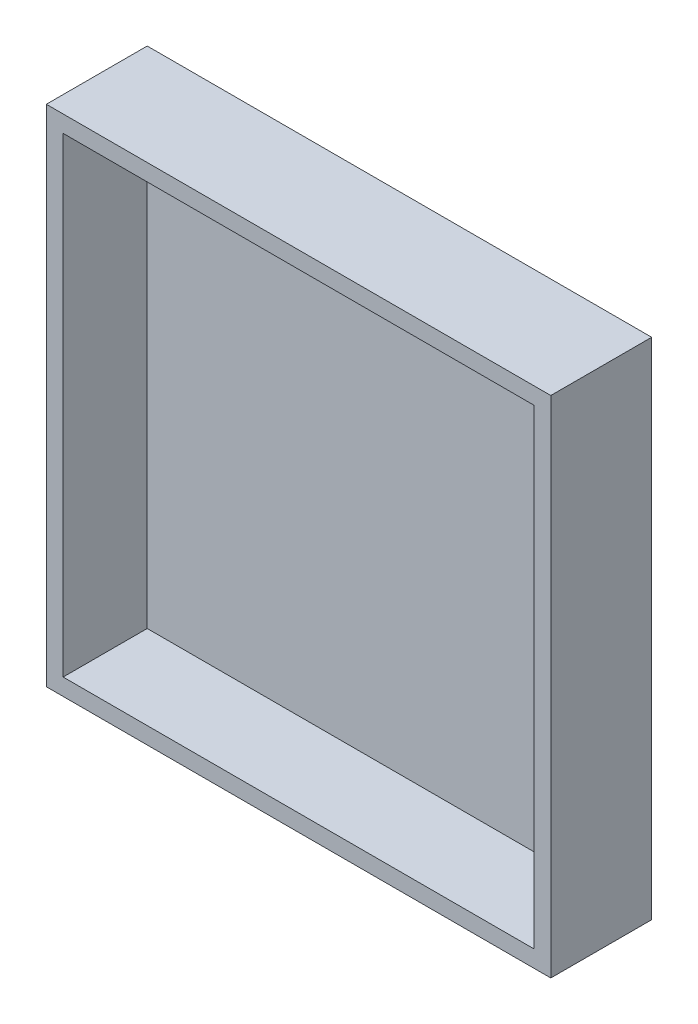
ISO-10303-21;
HEADER;
FILE_DESCRIPTION(('STEP AP214'),'2;1');
FILE_NAME('part.step','',(''),(''),'','','');
FILE_SCHEMA(('AUTOMOTIVE_DESIGN { 1 0 10303 214 1 1 1 1 }'));
ENDSEC;
DATA;
#1=APPLICATION_CONTEXT('core data for automotive mechanical design processes');
#2=APPLICATION_PROTOCOL_DEFINITION('international standard','automotive_design',2000,#1);
#3=PRODUCT_CONTEXT('',#1,'mechanical');
#4=PRODUCT('Part','Part','',(#3));
#5=PRODUCT_RELATED_PRODUCT_CATEGORY('part','',(#4));
#6=PRODUCT_DEFINITION_FORMATION('','',#4);
#7=PRODUCT_DEFINITION_CONTEXT('part definition',#1,'design');
#8=PRODUCT_DEFINITION('design','',#6,#7);
#9=PRODUCT_DEFINITION_SHAPE('','',#8);
#10=(LENGTH_UNIT() NAMED_UNIT(*) SI_UNIT(.MILLI.,.METRE.));
#11=(NAMED_UNIT(*) PLANE_ANGLE_UNIT() SI_UNIT($,.RADIAN.));
#12=(NAMED_UNIT(*) SI_UNIT($,.STERADIAN.) SOLID_ANGLE_UNIT());
#13=UNCERTAINTY_MEASURE_WITH_UNIT(LENGTH_MEASURE(1.E-05),#10,'distance_accuracy_value','');
#14=(GEOMETRIC_REPRESENTATION_CONTEXT(3) GLOBAL_UNCERTAINTY_ASSIGNED_CONTEXT((#13)) GLOBAL_UNIT_ASSIGNED_CONTEXT((#10,
#11,#12)) REPRESENTATION_CONTEXT('',''));
#15=CARTESIAN_POINT('',(0.,0.,0.));
#16=DIRECTION('',(0.,0.,1.));
#17=DIRECTION('',(1.,0.,0.));
#18=AXIS2_PLACEMENT_3D('',#15,#16,#17);
#19=CARTESIAN_POINT('',(0.,147.241880208751,30.));
#20=DIRECTION('',(-1.,0.,0.));
#21=DIRECTION('',(0.,-1.,0.));
#22=AXIS2_PLACEMENT_3D('',#19,#20,#21);
#23=PLANE('',#22);
#24=DIRECTION('',(0.,1.,0.));
#25=VECTOR('',#24,1.);
#26=CARTESIAN_POINT('',(0.,147.241880208751,0.));
#27=LINE('',#26,#25);
#28=CARTESIAN_POINT('',(0.,-2.75811979124917,0.));
#29=VERTEX_POINT('',#28);
#30=CARTESIAN_POINT('',(0.,147.241880208751,0.));
#31=VERTEX_POINT('',#30);
#32=EDGE_CURVE('E147',#29,#31,#27,.T.);
#33=ORIENTED_EDGE('',*,*,#32,.T.);
#34=DIRECTION('',(0.,0.,-1.));
#35=VECTOR('',#34,1.);
#36=CARTESIAN_POINT('',(0.,147.241880208751,30.));
#37=LINE('',#36,#35);
#38=CARTESIAN_POINT('',(0.,147.241880208751,30.));
#39=VERTEX_POINT('',#38);
#40=EDGE_CURVE('E11',#39,#31,#37,.T.);
#41=ORIENTED_EDGE('',*,*,#40,.F.);
#42=DIRECTION('',(0.,1.,0.));
#43=VECTOR('',#42,1.);
#44=CARTESIAN_POINT('',(0.,147.241880208751,30.));
#45=LINE('',#44,#43);
#46=CARTESIAN_POINT('',(0.,-2.75811979124917,30.));
#47=VERTEX_POINT('',#46);
#48=EDGE_CURVE('E140',#47,#39,#45,.T.);
#49=ORIENTED_EDGE('',*,*,#48,.F.);
#50=DIRECTION('',(0.,0.,-1.));
#51=VECTOR('',#50,1.);
#52=CARTESIAN_POINT('',(0.,-2.75811979124917,30.));
#53=LINE('',#52,#51);
#54=EDGE_CURVE('E146',#47,#29,#53,.T.);
#55=ORIENTED_EDGE('',*,*,#54,.T.);
#56=EDGE_LOOP('',(#33,#41,#49,#55));
#57=FACE_BOUND('',#56,.T.);
#58=ADVANCED_FACE('F33',(#57),#23,.F.);
#59=CARTESIAN_POINT('',(-150.,147.241880208751,30.));
#60=DIRECTION('',(0.,-1.,0.));
#61=DIRECTION('',(0.,0.,-1.));
#62=AXIS2_PLACEMENT_3D('',#59,#60,#61);
#63=PLANE('',#62);
#64=DIRECTION('',(-1.,0.,0.));
#65=VECTOR('',#64,1.);
#66=CARTESIAN_POINT('',(-150.,147.241880208751,0.));
#67=LINE('',#66,#65);
#68=CARTESIAN_POINT('',(-150.,147.241880208751,0.));
#69=VERTEX_POINT('',#68);
#70=EDGE_CURVE('E150',#31,#69,#67,.T.);
#71=ORIENTED_EDGE('',*,*,#70,.T.);
#72=DIRECTION('',(0.,0.,-1.));
#73=VECTOR('',#72,1.);
#74=CARTESIAN_POINT('',(-150.,147.241880208751,30.));
#75=LINE('',#74,#73);
#76=CARTESIAN_POINT('',(-150.,147.241880208751,30.));
#77=VERTEX_POINT('',#76);
#78=EDGE_CURVE('E40',#77,#69,#75,.T.);
#79=ORIENTED_EDGE('',*,*,#78,.F.);
#80=DIRECTION('',(-1.,0.,0.));
#81=VECTOR('',#80,1.);
#82=CARTESIAN_POINT('',(-150.,147.241880208751,30.));
#83=LINE('',#82,#81);
#84=EDGE_CURVE('E84',#39,#77,#83,.T.);
#85=ORIENTED_EDGE('',*,*,#84,.F.);
#86=ORIENTED_EDGE('',*,*,#40,.T.);
#87=EDGE_LOOP('',(#71,#79,#85,#86));
#88=FACE_BOUND('',#87,.T.);
#89=ADVANCED_FACE('F179',(#88),#63,.F.);
#90=CARTESIAN_POINT('',(-150.,147.241880208751,30.));
#91=DIRECTION('',(1.,0.,0.));
#92=DIRECTION('',(0.,0.,-1.));
#93=AXIS2_PLACEMENT_3D('',#90,#91,#92);
#94=PLANE('',#93);
#95=DIRECTION('',(0.,-1.,0.));
#96=VECTOR('',#95,1.);
#97=CARTESIAN_POINT('',(-150.,147.241880208751,0.));
#98=LINE('',#97,#96);
#99=CARTESIAN_POINT('',(-150.,-2.75811979124917,0.));
#100=VERTEX_POINT('',#99);
#101=EDGE_CURVE('E152',#69,#100,#98,.T.);
#102=ORIENTED_EDGE('',*,*,#101,.T.);
#103=DIRECTION('',(0.,0.,-1.));
#104=VECTOR('',#103,1.);
#105=CARTESIAN_POINT('',(-150.,-2.75811979124917,30.));
#106=LINE('',#105,#104);
#107=CARTESIAN_POINT('',(-150.,-2.75811979124917,30.));
#108=VERTEX_POINT('',#107);
#109=EDGE_CURVE('E156',#108,#100,#106,.T.);
#110=ORIENTED_EDGE('',*,*,#109,.F.);
#111=DIRECTION('',(0.,-1.,0.));
#112=VECTOR('',#111,1.);
#113=CARTESIAN_POINT('',(-150.,147.241880208751,30.));
#114=LINE('',#113,#112);
#115=EDGE_CURVE('E143',#77,#108,#114,.T.);
#116=ORIENTED_EDGE('',*,*,#115,.F.);
#117=ORIENTED_EDGE('',*,*,#78,.T.);
#118=EDGE_LOOP('',(#102,#110,#116,#117));
#119=FACE_BOUND('',#118,.T.);
#120=ADVANCED_FACE('F161',(#119),#94,.F.);
#121=CARTESIAN_POINT('',(-150.,-2.75811979124917,30.));
#122=DIRECTION('',(0.,1.,0.));
#123=DIRECTION('',(0.,0.,1.));
#124=AXIS2_PLACEMENT_3D('',#121,#122,#123);
#125=PLANE('',#124);
#126=DIRECTION('',(1.,0.,0.));
#127=VECTOR('',#126,1.);
#128=CARTESIAN_POINT('',(-150.,-2.75811979124917,0.));
#129=LINE('',#128,#127);
#130=EDGE_CURVE('E77',#100,#29,#129,.T.);
#131=ORIENTED_EDGE('',*,*,#130,.T.);
#132=ORIENTED_EDGE('',*,*,#54,.F.);
#133=DIRECTION('',(1.,0.,0.));
#134=VECTOR('',#133,1.);
#135=CARTESIAN_POINT('',(-150.,-2.75811979124917,30.));
#136=LINE('',#135,#134);
#137=EDGE_CURVE('E56',#108,#47,#136,.T.);
#138=ORIENTED_EDGE('',*,*,#137,.F.);
#139=ORIENTED_EDGE('',*,*,#109,.T.);
#140=EDGE_LOOP('',(#131,#132,#138,#139));
#141=FACE_BOUND('',#140,.T.);
#142=ADVANCED_FACE('F169',(#141),#125,.F.);
#143=CARTESIAN_POINT('',(0.,-2.75811979124917,30.));
#144=DIRECTION('',(0.,0.,1.));
#145=DIRECTION('',(1.,0.,0.));
#146=AXIS2_PLACEMENT_3D('',#143,#144,#145);
#147=PLANE('',#146);
#148=DIRECTION('',(0.,1.,0.));
#149=VECTOR('',#148,1.);
#150=CARTESIAN_POINT('',(-5.00000000000002,147.241880208751,30.));
#151=LINE('',#150,#149);
#152=CARTESIAN_POINT('',(-5.,2.24188020875083,30.));
#153=VERTEX_POINT('',#152);
#154=CARTESIAN_POINT('',(-5.00000000000002,142.241880208751,30.));
#155=VERTEX_POINT('',#154);
#156=EDGE_CURVE('E129',#153,#155,#151,.T.);
#157=ORIENTED_EDGE('',*,*,#156,.F.);
#158=DIRECTION('',(1.,0.,0.));
#159=VECTOR('',#158,1.);
#160=CARTESIAN_POINT('',(-150.,2.24188020875083,30.));
#161=LINE('',#160,#159);
#162=CARTESIAN_POINT('',(-145.,2.24188020875083,30.));
#163=VERTEX_POINT('',#162);
#164=EDGE_CURVE('E138',#163,#153,#161,.T.);
#165=ORIENTED_EDGE('',*,*,#164,.F.);
#166=DIRECTION('',(0.,-1.,0.));
#167=VECTOR('',#166,1.);
#168=CARTESIAN_POINT('',(-145.,147.241880208751,30.));
#169=LINE('',#168,#167);
#170=CARTESIAN_POINT('',(-145.,142.241880208751,30.));
#171=VERTEX_POINT('',#170);
#172=EDGE_CURVE('E136',#171,#163,#169,.T.);
#173=ORIENTED_EDGE('',*,*,#172,.F.);
#174=DIRECTION('',(-1.,0.,0.));
#175=VECTOR('',#174,1.);
#176=CARTESIAN_POINT('',(-150.,142.241880208751,30.));
#177=LINE('',#176,#175);
#178=EDGE_CURVE('E121',#155,#171,#177,.T.);
#179=ORIENTED_EDGE('',*,*,#178,.F.);
#180=EDGE_LOOP('',(#157,#165,#173,#179));
#181=FACE_BOUND('',#180,.T.);
#182=ORIENTED_EDGE('',*,*,#48,.T.);
#183=ORIENTED_EDGE('',*,*,#84,.T.);
#184=ORIENTED_EDGE('',*,*,#115,.T.);
#185=ORIENTED_EDGE('',*,*,#137,.T.);
#186=EDGE_LOOP('',(#182,#183,#184,#185));
#187=FACE_BOUND('',#186,.T.);
#188=ADVANCED_FACE('F171',(#181,#187),#147,.T.);
#189=CARTESIAN_POINT('',(0.,-2.75811979124917,0.));
#190=DIRECTION('',(0.,0.,1.));
#191=DIRECTION('',(1.,0.,0.));
#192=AXIS2_PLACEMENT_3D('',#189,#190,#191);
#193=PLANE('',#192);
#194=ORIENTED_EDGE('',*,*,#32,.F.);
#195=ORIENTED_EDGE('',*,*,#130,.F.);
#196=ORIENTED_EDGE('',*,*,#101,.F.);
#197=ORIENTED_EDGE('',*,*,#70,.F.);
#198=EDGE_LOOP('',(#194,#195,#196,#197));
#199=FACE_BOUND('',#198,.T.);
#200=ADVANCED_FACE('F165',(#199),#193,.F.);
#201=CARTESIAN_POINT('',(-5.00000000000002,147.241880208751,30.));
#202=DIRECTION('',(-1.,0.,0.));
#203=DIRECTION('',(0.,-1.,0.));
#204=AXIS2_PLACEMENT_3D('',#201,#202,#203);
#205=PLANE('',#204);
#206=DIRECTION('',(0.,1.,0.));
#207=VECTOR('',#206,1.);
#208=CARTESIAN_POINT('',(-5.00000000000002,147.241880208751,5.));
#209=LINE('',#208,#207);
#210=CARTESIAN_POINT('',(-5.,2.24188020875083,5.));
#211=VERTEX_POINT('',#210);
#212=CARTESIAN_POINT('',(-5.00000000000002,142.241880208751,5.));
#213=VERTEX_POINT('',#212);
#214=EDGE_CURVE('E112',#211,#213,#209,.T.);
#215=ORIENTED_EDGE('',*,*,#214,.F.);
#216=DIRECTION('',(0.,0.,-1.));
#217=VECTOR('',#216,1.);
#218=CARTESIAN_POINT('',(-5.,2.24188020875082,30.));
#219=LINE('',#218,#217);
#220=EDGE_CURVE('E132',#153,#211,#219,.T.);
#221=ORIENTED_EDGE('',*,*,#220,.F.);
#222=ORIENTED_EDGE('',*,*,#156,.T.);
#223=DIRECTION('',(0.,0.,-1.));
#224=VECTOR('',#223,1.);
#225=CARTESIAN_POINT('',(-5.00000000000003,142.241880208751,30.));
#226=LINE('',#225,#224);
#227=EDGE_CURVE('E124',#155,#213,#226,.T.);
#228=ORIENTED_EDGE('',*,*,#227,.T.);
#229=EDGE_LOOP('',(#215,#221,#222,#228));
#230=FACE_BOUND('',#229,.T.);
#231=ADVANCED_FACE('F206',(#230),#205,.T.);
#232=CARTESIAN_POINT('',(-150.,142.241880208751,30.));
#233=DIRECTION('',(0.,-1.,0.));
#234=DIRECTION('',(0.,0.,-1.));
#235=AXIS2_PLACEMENT_3D('',#232,#233,#234);
#236=PLANE('',#235);
#237=DIRECTION('',(-1.,0.,0.));
#238=VECTOR('',#237,1.);
#239=CARTESIAN_POINT('',(-150.,142.241880208751,5.));
#240=LINE('',#239,#238);
#241=CARTESIAN_POINT('',(-145.,142.241880208751,5.));
#242=VERTEX_POINT('',#241);
#243=EDGE_CURVE('E106',#213,#242,#240,.T.);
#244=ORIENTED_EDGE('',*,*,#243,.F.);
#245=ORIENTED_EDGE('',*,*,#227,.F.);
#246=ORIENTED_EDGE('',*,*,#178,.T.);
#247=DIRECTION('',(0.,0.,-1.));
#248=VECTOR('',#247,1.);
#249=CARTESIAN_POINT('',(-145.,142.241880208751,30.));
#250=LINE('',#249,#248);
#251=EDGE_CURVE('E118',#171,#242,#250,.T.);
#252=ORIENTED_EDGE('',*,*,#251,.T.);
#253=EDGE_LOOP('',(#244,#245,#246,#252));
#254=FACE_BOUND('',#253,.T.);
#255=ADVANCED_FACE('F119',(#254),#236,.T.);
#256=CARTESIAN_POINT('',(-145.,147.241880208751,30.));
#257=DIRECTION('',(1.,0.,0.));
#258=DIRECTION('',(0.,0.,-1.));
#259=AXIS2_PLACEMENT_3D('',#256,#257,#258);
#260=PLANE('',#259);
#261=DIRECTION('',(0.,-1.,0.));
#262=VECTOR('',#261,1.);
#263=CARTESIAN_POINT('',(-145.,147.241880208751,5.));
#264=LINE('',#263,#262);
#265=CARTESIAN_POINT('',(-145.,2.24188020875083,5.));
#266=VERTEX_POINT('',#265);
#267=EDGE_CURVE('E110',#242,#266,#264,.T.);
#268=ORIENTED_EDGE('',*,*,#267,.F.);
#269=ORIENTED_EDGE('',*,*,#251,.F.);
#270=ORIENTED_EDGE('',*,*,#172,.T.);
#271=DIRECTION('',(0.,0.,-1.));
#272=VECTOR('',#271,1.);
#273=CARTESIAN_POINT('',(-145.,2.24188020875083,30.));
#274=LINE('',#273,#272);
#275=EDGE_CURVE('E47',#163,#266,#274,.T.);
#276=ORIENTED_EDGE('',*,*,#275,.T.);
#277=EDGE_LOOP('',(#268,#269,#270,#276));
#278=FACE_BOUND('',#277,.T.);
#279=ADVANCED_FACE('F126',(#278),#260,.T.);
#280=CARTESIAN_POINT('',(-150.,2.24188020875083,30.));
#281=DIRECTION('',(0.,1.,0.));
#282=DIRECTION('',(0.,0.,1.));
#283=AXIS2_PLACEMENT_3D('',#280,#281,#282);
#284=PLANE('',#283);
#285=DIRECTION('',(1.,0.,0.));
#286=VECTOR('',#285,1.);
#287=CARTESIAN_POINT('',(-150.,2.24188020875083,5.));
#288=LINE('',#287,#286);
#289=EDGE_CURVE('E127',#266,#211,#288,.T.);
#290=ORIENTED_EDGE('',*,*,#289,.F.);
#291=ORIENTED_EDGE('',*,*,#275,.F.);
#292=ORIENTED_EDGE('',*,*,#164,.T.);
#293=ORIENTED_EDGE('',*,*,#220,.T.);
#294=EDGE_LOOP('',(#290,#291,#292,#293));
#295=FACE_BOUND('',#294,.T.);
#296=ADVANCED_FACE('F236',(#295),#284,.T.);
#297=CARTESIAN_POINT('',(0.,-2.75811979124917,5.));
#298=DIRECTION('',(0.,0.,1.));
#299=DIRECTION('',(1.,0.,0.));
#300=AXIS2_PLACEMENT_3D('',#297,#298,#299);
#301=PLANE('',#300);
#302=ORIENTED_EDGE('',*,*,#214,.T.);
#303=ORIENTED_EDGE('',*,*,#243,.T.);
#304=ORIENTED_EDGE('',*,*,#267,.T.);
#305=ORIENTED_EDGE('',*,*,#289,.T.);
#306=EDGE_LOOP('',(#302,#303,#304,#305));
#307=FACE_BOUND('',#306,.T.);
#308=ADVANCED_FACE('F108',(#307),#301,.T.);
#309=CLOSED_SHELL('',(#58,#89,#120,#142,#188,#200,#231,#255,#279,#296,#308));
#310=MANIFOLD_SOLID_BREP('B2',#309);
#311=ADVANCED_BREP_SHAPE_REPRESENTATION('',(#18,#310),#14);
#312=SHAPE_DEFINITION_REPRESENTATION(#9,#311);
ENDSEC;
END-ISO-10303-21;
